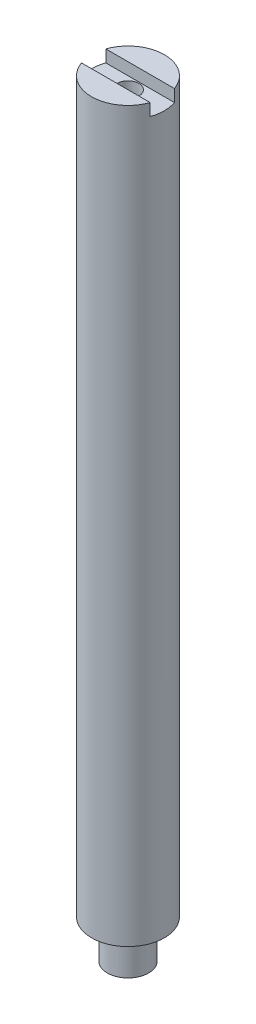
ISO-10303-21;
HEADER;
FILE_DESCRIPTION(('STEP AP214'),'2;1');
FILE_NAME('part.step','',(''),(''),'','','');
FILE_SCHEMA(('AUTOMOTIVE_DESIGN { 1 0 10303 214 1 1 1 1 }'));
ENDSEC;
DATA;
#1=APPLICATION_CONTEXT('core data for automotive mechanical design processes');
#2=APPLICATION_PROTOCOL_DEFINITION('international standard','automotive_design',2000,#1);
#3=PRODUCT_CONTEXT('',#1,'mechanical');
#4=PRODUCT('Part','Part','',(#3));
#5=PRODUCT_RELATED_PRODUCT_CATEGORY('part','',(#4));
#6=PRODUCT_DEFINITION_FORMATION('','',#4);
#7=PRODUCT_DEFINITION_CONTEXT('part definition',#1,'design');
#8=PRODUCT_DEFINITION('design','',#6,#7);
#9=PRODUCT_DEFINITION_SHAPE('','',#8);
#10=(LENGTH_UNIT() NAMED_UNIT(*) SI_UNIT(.MILLI.,.METRE.));
#11=(NAMED_UNIT(*) PLANE_ANGLE_UNIT() SI_UNIT($,.RADIAN.));
#12=(NAMED_UNIT(*) SI_UNIT($,.STERADIAN.) SOLID_ANGLE_UNIT());
#13=UNCERTAINTY_MEASURE_WITH_UNIT(LENGTH_MEASURE(1.E-05),#10,'distance_accuracy_value','');
#14=(GEOMETRIC_REPRESENTATION_CONTEXT(3) GLOBAL_UNCERTAINTY_ASSIGNED_CONTEXT((#13)) GLOBAL_UNIT_ASSIGNED_CONTEXT((#10,
#11,#12)) REPRESENTATION_CONTEXT('',''));
#15=CARTESIAN_POINT('',(0.,0.,0.));
#16=DIRECTION('',(0.,0.,1.));
#17=DIRECTION('',(1.,0.,0.));
#18=AXIS2_PLACEMENT_3D('',#15,#16,#17);
#19=CARTESIAN_POINT('',(0.,157.9,0.));
#20=DIRECTION('',(0.,1.,0.));
#21=DIRECTION('',(0.,0.,1.));
#22=AXIS2_PLACEMENT_3D('',#19,#20,#21);
#23=PLANE('',#22);
#24=DIRECTION('',(1.,0.,0.));
#25=VECTOR('',#24,1.);
#26=CARTESIAN_POINT('',(-7.5,157.9,2.5));
#27=LINE('',#26,#25);
#28=CARTESIAN_POINT('',(-7.07106781186548,157.9,2.5));
#29=VERTEX_POINT('',#28);
#30=CARTESIAN_POINT('',(7.07106781186548,157.9,2.5));
#31=VERTEX_POINT('',#30);
#32=EDGE_CURVE('E96',#29,#31,#27,.T.);
#33=ORIENTED_EDGE('',*,*,#32,.F.);
#34=CARTESIAN_POINT('',(0.,157.9,0.));
#35=DIRECTION('',(0.,1.,0.));
#36=DIRECTION('',(0.,0.,1.));
#37=AXIS2_PLACEMENT_3D('',#34,#35,#36);
#38=CIRCLE('',#37,7.5);
#39=EDGE_CURVE('E106',#29,#31,#38,.T.);
#40=ORIENTED_EDGE('',*,*,#39,.T.);
#41=EDGE_LOOP('',(#33,#40));
#42=FACE_BOUND('',#41,.T.);
#43=ADVANCED_FACE('F45',(#42),#23,.T.);
#44=CARTESIAN_POINT('',(0.,7.9,0.));
#45=DIRECTION('',(0.,-1.,0.));
#46=DIRECTION('',(0.,0.,-1.));
#47=AXIS2_PLACEMENT_3D('',#44,#45,#46);
#48=CYLINDRICAL_SURFACE('',#47,4.25);
#49=CARTESIAN_POINT('',(0.,7.9,0.));
#50=DIRECTION('',(0.,1.,0.));
#51=DIRECTION('',(0.,0.,1.));
#52=AXIS2_PLACEMENT_3D('',#49,#50,#51);
#53=CIRCLE('',#52,4.25);
#54=CARTESIAN_POINT('',(0.,7.9,4.25));
#55=VERTEX_POINT('',#54);
#56=EDGE_CURVE('E12',#55,#55,#53,.T.);
#57=ORIENTED_EDGE('',*,*,#56,.F.);
#58=EDGE_LOOP('',(#57));
#59=FACE_BOUND('',#58,.T.);
#60=CARTESIAN_POINT('',(0.,0.,0.));
#61=DIRECTION('',(0.,1.,0.));
#62=DIRECTION('',(0.,0.,1.));
#63=AXIS2_PLACEMENT_3D('',#60,#61,#62);
#64=CIRCLE('',#63,4.25);
#65=CARTESIAN_POINT('',(0.,0.,4.25));
#66=VERTEX_POINT('',#65);
#67=EDGE_CURVE('E55',#66,#66,#64,.T.);
#68=ORIENTED_EDGE('',*,*,#67,.T.);
#69=EDGE_LOOP('',(#68));
#70=FACE_BOUND('',#69,.T.);
#71=ADVANCED_FACE('F47',(#59,#70),#48,.T.);
#72=CARTESIAN_POINT('',(0.,0.,0.));
#73=DIRECTION('',(0.,1.,0.));
#74=DIRECTION('',(0.,0.,1.));
#75=AXIS2_PLACEMENT_3D('',#72,#73,#74);
#76=PLANE('',#75);
#77=CARTESIAN_POINT('',(0.,0.,0.));
#78=DIRECTION('',(0.,1.,0.));
#79=DIRECTION('',(0.,0.,1.));
#80=AXIS2_PLACEMENT_3D('',#77,#78,#79);
#81=CIRCLE('',#80,2.25);
#82=CARTESIAN_POINT('',(0.,0.,2.25));
#83=VERTEX_POINT('',#82);
#84=EDGE_CURVE('E115',#83,#83,#81,.T.);
#85=ORIENTED_EDGE('',*,*,#84,.T.);
#86=EDGE_LOOP('',(#85));
#87=FACE_BOUND('',#86,.T.);
#88=ORIENTED_EDGE('',*,*,#67,.F.);
#89=EDGE_LOOP('',(#88));
#90=FACE_BOUND('',#89,.T.);
#91=ADVANCED_FACE('F159',(#87,#90),#76,.F.);
#92=CARTESIAN_POINT('',(0.,157.9,0.));
#93=DIRECTION('',(0.,-1.,0.));
#94=DIRECTION('',(0.,0.,-1.));
#95=AXIS2_PLACEMENT_3D('',#92,#93,#94);
#96=CYLINDRICAL_SURFACE('',#95,7.5);
#97=CARTESIAN_POINT('',(0.,155.4,0.));
#98=DIRECTION('',(0.,-1.,0.));
#99=DIRECTION('',(0.,0.,-1.));
#100=AXIS2_PLACEMENT_3D('',#97,#98,#99);
#101=CIRCLE('',#100,7.5);
#102=CARTESIAN_POINT('',(7.07106781186548,155.4,-2.5));
#103=VERTEX_POINT('',#102);
#104=CARTESIAN_POINT('',(7.07106781186548,155.4,2.5));
#105=VERTEX_POINT('',#104);
#106=EDGE_CURVE('E102',#103,#105,#101,.T.);
#107=ORIENTED_EDGE('',*,*,#106,.T.);
#108=DIRECTION('',(0.,-1.,0.));
#109=VECTOR('',#108,1.);
#110=CARTESIAN_POINT('',(7.07106781186548,157.9,2.5));
#111=LINE('',#110,#109);
#112=EDGE_CURVE('E126',#105,#31,#111,.F.);
#113=ORIENTED_EDGE('',*,*,#112,.T.);
#114=ORIENTED_EDGE('',*,*,#39,.F.);
#115=DIRECTION('',(0.,-1.,0.));
#116=VECTOR('',#115,1.);
#117=CARTESIAN_POINT('',(-7.07106781186548,157.9,2.5));
#118=LINE('',#117,#116);
#119=CARTESIAN_POINT('',(-7.07106781186548,155.4,2.5));
#120=VERTEX_POINT('',#119);
#121=EDGE_CURVE('E122',#29,#120,#118,.T.);
#122=ORIENTED_EDGE('',*,*,#121,.T.);
#123=CARTESIAN_POINT('',(-7.07106781186548,155.4,-2.5));
#124=VERTEX_POINT('',#123);
#125=EDGE_CURVE('E71',#120,#124,#101,.T.);
#126=ORIENTED_EDGE('',*,*,#125,.T.);
#127=DIRECTION('',(0.,-1.,0.));
#128=VECTOR('',#127,1.);
#129=CARTESIAN_POINT('',(-7.07106781186548,157.9,-2.5));
#130=LINE('',#129,#128);
#131=CARTESIAN_POINT('',(-7.07106781186548,157.9,-2.5));
#132=VERTEX_POINT('',#131);
#133=EDGE_CURVE('E90',#124,#132,#130,.F.);
#134=ORIENTED_EDGE('',*,*,#133,.T.);
#135=CARTESIAN_POINT('',(7.07106781186548,157.9,-2.5));
#136=VERTEX_POINT('',#135);
#137=EDGE_CURVE('E100',#136,#132,#38,.T.);
#138=ORIENTED_EDGE('',*,*,#137,.F.);
#139=DIRECTION('',(0.,-1.,0.));
#140=VECTOR('',#139,1.);
#141=CARTESIAN_POINT('',(7.07106781186548,157.9,-2.5));
#142=LINE('',#141,#140);
#143=EDGE_CURVE('E63',#136,#103,#142,.T.);
#144=ORIENTED_EDGE('',*,*,#143,.T.);
#145=EDGE_LOOP('',(#107,#113,#114,#122,#126,#134,#138,#144));
#146=FACE_BOUND('',#145,.T.);
#147=CARTESIAN_POINT('',(0.,7.9,0.));
#148=DIRECTION('',(0.,1.,0.));
#149=DIRECTION('',(0.,0.,1.));
#150=AXIS2_PLACEMENT_3D('',#147,#148,#149);
#151=CIRCLE('',#150,7.5);
#152=CARTESIAN_POINT('',(0.,7.9,7.5));
#153=VERTEX_POINT('',#152);
#154=EDGE_CURVE('E112',#153,#153,#151,.T.);
#155=ORIENTED_EDGE('',*,*,#154,.T.);
#156=EDGE_LOOP('',(#155));
#157=FACE_BOUND('',#156,.T.);
#158=ADVANCED_FACE('F98',(#146,#157),#96,.T.);
#159=DIRECTION('',(-1.,0.,0.));
#160=VECTOR('',#159,1.);
#161=CARTESIAN_POINT('',(-7.5,157.9,-2.5));
#162=LINE('',#161,#160);
#163=EDGE_CURVE('E88',#136,#132,#162,.T.);
#164=ORIENTED_EDGE('',*,*,#163,.F.);
#165=ORIENTED_EDGE('',*,*,#137,.T.);
#166=EDGE_LOOP('',(#164,#165));
#167=FACE_BOUND('',#166,.T.);
#168=ADVANCED_FACE('F104',(#167),#23,.T.);
#169=CARTESIAN_POINT('',(0.,7.9,0.));
#170=DIRECTION('',(0.,1.,0.));
#171=DIRECTION('',(0.,0.,1.));
#172=AXIS2_PLACEMENT_3D('',#169,#170,#171);
#173=PLANE('',#172);
#174=ORIENTED_EDGE('',*,*,#56,.T.);
#175=EDGE_LOOP('',(#174));
#176=FACE_BOUND('',#175,.T.);
#177=ORIENTED_EDGE('',*,*,#154,.F.);
#178=EDGE_LOOP('',(#177));
#179=FACE_BOUND('',#178,.T.);
#180=ADVANCED_FACE('F164',(#176,#179),#173,.F.);
#181=CARTESIAN_POINT('',(0.,0.,0.));
#182=DIRECTION('',(0.,1.,0.));
#183=DIRECTION('',(0.,0.,1.));
#184=AXIS2_PLACEMENT_3D('',#181,#182,#183);
#185=CYLINDRICAL_SURFACE('',#184,2.25);
#186=CARTESIAN_POINT('',(0.,155.4,0.));
#187=DIRECTION('',(0.,-1.,0.));
#188=DIRECTION('',(0.,0.,-1.));
#189=AXIS2_PLACEMENT_3D('',#186,#187,#188);
#190=CIRCLE('',#189,2.25);
#191=CARTESIAN_POINT('',(0.,155.4,-2.25));
#192=VERTEX_POINT('',#191);
#193=EDGE_CURVE('E49',#192,#192,#190,.F.);
#194=ORIENTED_EDGE('',*,*,#193,.T.);
#195=EDGE_LOOP('',(#194));
#196=FACE_BOUND('',#195,.T.);
#197=ORIENTED_EDGE('',*,*,#84,.F.);
#198=EDGE_LOOP('',(#197));
#199=FACE_BOUND('',#198,.T.);
#200=ADVANCED_FACE('F169',(#196,#199),#185,.F.);
#201=CARTESIAN_POINT('',(-7.5,155.4,2.5));
#202=DIRECTION('',(0.,0.,1.));
#203=DIRECTION('',(1.,0.,0.));
#204=AXIS2_PLACEMENT_3D('',#201,#202,#203);
#205=PLANE('',#204);
#206=ORIENTED_EDGE('',*,*,#32,.T.);
#207=ORIENTED_EDGE('',*,*,#112,.F.);
#208=DIRECTION('',(1.,0.,0.));
#209=VECTOR('',#208,1.);
#210=CARTESIAN_POINT('',(-7.5,155.4,2.5));
#211=LINE('',#210,#209);
#212=EDGE_CURVE('E139',#120,#105,#211,.T.);
#213=ORIENTED_EDGE('',*,*,#212,.F.);
#214=ORIENTED_EDGE('',*,*,#121,.F.);
#215=EDGE_LOOP('',(#206,#207,#213,#214));
#216=FACE_BOUND('',#215,.T.);
#217=ADVANCED_FACE('F149',(#216),#205,.F.);
#218=CARTESIAN_POINT('',(-7.5,155.4,-2.5));
#219=DIRECTION('',(0.,0.,-1.));
#220=DIRECTION('',(-1.,0.,0.));
#221=AXIS2_PLACEMENT_3D('',#218,#219,#220);
#222=PLANE('',#221);
#223=ORIENTED_EDGE('',*,*,#163,.T.);
#224=ORIENTED_EDGE('',*,*,#133,.F.);
#225=DIRECTION('',(-1.,0.,0.));
#226=VECTOR('',#225,1.);
#227=CARTESIAN_POINT('',(-7.5,155.4,-2.5));
#228=LINE('',#227,#226);
#229=EDGE_CURVE('E137',#103,#124,#228,.T.);
#230=ORIENTED_EDGE('',*,*,#229,.F.);
#231=ORIENTED_EDGE('',*,*,#143,.F.);
#232=EDGE_LOOP('',(#223,#224,#230,#231));
#233=FACE_BOUND('',#232,.T.);
#234=ADVANCED_FACE('F89',(#233),#222,.F.);
#235=CARTESIAN_POINT('',(0.,155.4,0.));
#236=DIRECTION('',(0.,-1.,0.));
#237=DIRECTION('',(0.,0.,-1.));
#238=AXIS2_PLACEMENT_3D('',#235,#236,#237);
#239=PLANE('',#238);
#240=ORIENTED_EDGE('',*,*,#193,.F.);
#241=EDGE_LOOP('',(#240));
#242=FACE_BOUND('',#241,.T.);
#243=ORIENTED_EDGE('',*,*,#229,.T.);
#244=ORIENTED_EDGE('',*,*,#125,.F.);
#245=ORIENTED_EDGE('',*,*,#212,.T.);
#246=ORIENTED_EDGE('',*,*,#106,.F.);
#247=EDGE_LOOP('',(#243,#244,#245,#246));
#248=FACE_BOUND('',#247,.T.);
#249=ADVANCED_FACE('F145',(#242,#248),#239,.F.);
#250=CLOSED_SHELL('',(#43,#71,#91,#158,#168,#180,#200,#217,#234,#249));
#251=MANIFOLD_SOLID_BREP('B2',#250);
#252=ADVANCED_BREP_SHAPE_REPRESENTATION('',(#18,#251),#14);
#253=SHAPE_DEFINITION_REPRESENTATION(#9,#252);
ENDSEC;
END-ISO-10303-21;
